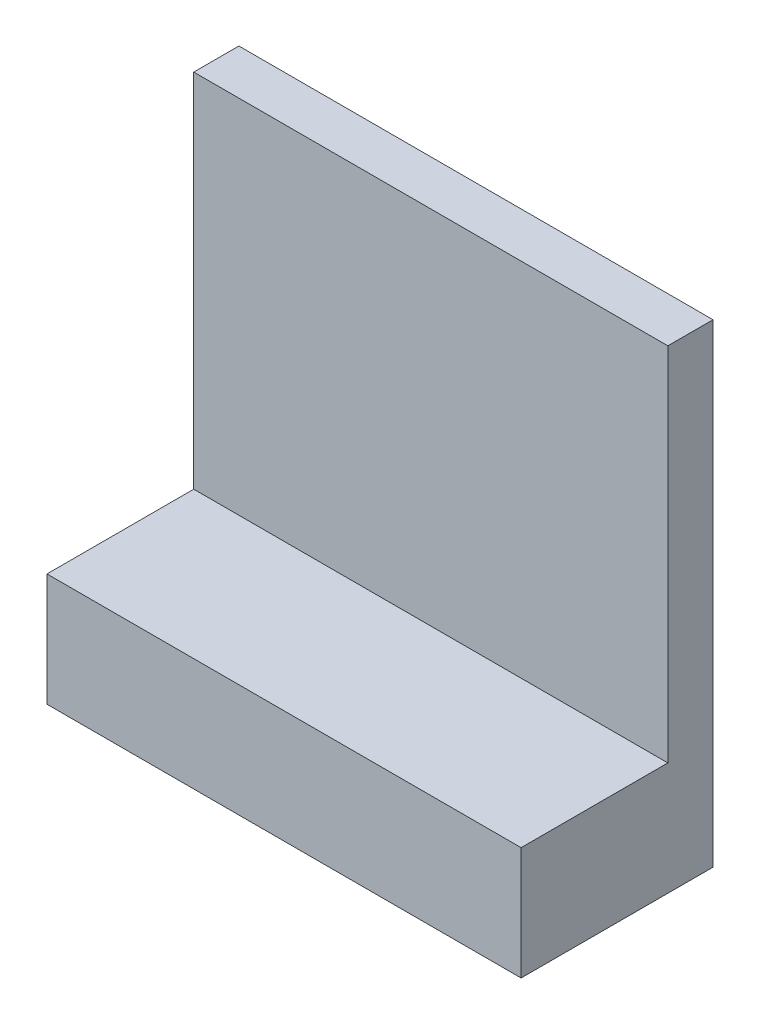
ISO-10303-21;
HEADER;
FILE_DESCRIPTION(('STEP AP214'),'2;1');
FILE_NAME('part.step','',(''),(''),'','','');
FILE_SCHEMA(('AUTOMOTIVE_DESIGN { 1 0 10303 214 1 1 1 1 }'));
ENDSEC;
DATA;
#1=APPLICATION_CONTEXT('core data for automotive mechanical design processes');
#2=APPLICATION_PROTOCOL_DEFINITION('international standard','automotive_design',2000,#1);
#3=PRODUCT_CONTEXT('',#1,'mechanical');
#4=PRODUCT('Part','Part','',(#3));
#5=PRODUCT_RELATED_PRODUCT_CATEGORY('part','',(#4));
#6=PRODUCT_DEFINITION_FORMATION('','',#4);
#7=PRODUCT_DEFINITION_CONTEXT('part definition',#1,'design');
#8=PRODUCT_DEFINITION('design','',#6,#7);
#9=PRODUCT_DEFINITION_SHAPE('','',#8);
#10=(LENGTH_UNIT() NAMED_UNIT(*) SI_UNIT(.MILLI.,.METRE.));
#11=(NAMED_UNIT(*) PLANE_ANGLE_UNIT() SI_UNIT($,.RADIAN.));
#12=(NAMED_UNIT(*) SI_UNIT($,.STERADIAN.) SOLID_ANGLE_UNIT());
#13=UNCERTAINTY_MEASURE_WITH_UNIT(LENGTH_MEASURE(1.E-05),#10,'distance_accuracy_value','');
#14=(GEOMETRIC_REPRESENTATION_CONTEXT(3) GLOBAL_UNCERTAINTY_ASSIGNED_CONTEXT((#13)) GLOBAL_UNIT_ASSIGNED_CONTEXT((#10,
#11,#12)) REPRESENTATION_CONTEXT('',''));
#15=CARTESIAN_POINT('',(0.,0.,0.));
#16=DIRECTION('',(0.,0.,1.));
#17=DIRECTION('',(1.,0.,0.));
#18=AXIS2_PLACEMENT_3D('',#15,#16,#17);
#19=CARTESIAN_POINT('',(-21.,21.,17.));
#20=DIRECTION('',(0.,-1.,0.));
#21=DIRECTION('',(0.,0.,-1.));
#22=AXIS2_PLACEMENT_3D('',#19,#20,#21);
#23=PLANE('',#22);
#24=DIRECTION('',(-1.,0.,0.));
#25=VECTOR('',#24,1.);
#26=CARTESIAN_POINT('',(-21.,21.,4.));
#27=LINE('',#26,#25);
#28=CARTESIAN_POINT('',(21.,21.,4.));
#29=VERTEX_POINT('',#28);
#30=CARTESIAN_POINT('',(-21.,21.,4.));
#31=VERTEX_POINT('',#30);
#32=EDGE_CURVE('E118',#29,#31,#27,.T.);
#33=ORIENTED_EDGE('',*,*,#32,.F.);
#34=DIRECTION('',(0.,0.,-1.));
#35=VECTOR('',#34,1.);
#36=CARTESIAN_POINT('',(21.,21.,17.));
#37=LINE('',#36,#35);
#38=CARTESIAN_POINT('',(21.,21.,0.));
#39=VERTEX_POINT('',#38);
#40=EDGE_CURVE('E11',#29,#39,#37,.T.);
#41=ORIENTED_EDGE('',*,*,#40,.T.);
#42=DIRECTION('',(-1.,0.,0.));
#43=VECTOR('',#42,1.);
#44=CARTESIAN_POINT('',(-21.,21.,0.));
#45=LINE('',#44,#43);
#46=CARTESIAN_POINT('',(-21.,21.,0.));
#47=VERTEX_POINT('',#46);
#48=EDGE_CURVE('E98',#39,#47,#45,.T.);
#49=ORIENTED_EDGE('',*,*,#48,.T.);
#50=DIRECTION('',(0.,0.,-1.));
#51=VECTOR('',#50,1.);
#52=CARTESIAN_POINT('',(-21.,21.,17.));
#53=LINE('',#52,#51);
#54=EDGE_CURVE('E41',#31,#47,#53,.T.);
#55=ORIENTED_EDGE('',*,*,#54,.F.);
#56=EDGE_LOOP('',(#33,#41,#49,#55));
#57=FACE_BOUND('',#56,.T.);
#58=ADVANCED_FACE('F33',(#57),#23,.F.);
#59=CARTESIAN_POINT('',(21.,-21.,17.));
#60=DIRECTION('',(-1.,0.,0.));
#61=DIRECTION('',(0.,0.,1.));
#62=AXIS2_PLACEMENT_3D('',#59,#60,#61);
#63=PLANE('',#62);
#64=DIRECTION('',(0.,1.,0.));
#65=VECTOR('',#64,1.);
#66=CARTESIAN_POINT('',(21.,21.,4.));
#67=LINE('',#66,#65);
#68=CARTESIAN_POINT('',(21.,-11.,4.));
#69=VERTEX_POINT('',#68);
#70=EDGE_CURVE('E121',#69,#29,#67,.T.);
#71=ORIENTED_EDGE('',*,*,#70,.F.);
#72=DIRECTION('',(0.,0.,1.));
#73=VECTOR('',#72,1.);
#74=CARTESIAN_POINT('',(21.,-11.,4.));
#75=LINE('',#74,#73);
#76=CARTESIAN_POINT('',(21.,-11.,17.));
#77=VERTEX_POINT('',#76);
#78=EDGE_CURVE('E99',#69,#77,#75,.T.);
#79=ORIENTED_EDGE('',*,*,#78,.T.);
#80=DIRECTION('',(0.,1.,0.));
#81=VECTOR('',#80,1.);
#82=CARTESIAN_POINT('',(21.,-21.,17.));
#83=LINE('',#82,#81);
#84=CARTESIAN_POINT('',(21.,-21.,17.));
#85=VERTEX_POINT('',#84);
#86=EDGE_CURVE('E85',#85,#77,#83,.T.);
#87=ORIENTED_EDGE('',*,*,#86,.F.);
#88=DIRECTION('',(0.,0.,-1.));
#89=VECTOR('',#88,1.);
#90=CARTESIAN_POINT('',(21.,-21.,17.));
#91=LINE('',#90,#89);
#92=CARTESIAN_POINT('',(21.,-21.,0.));
#93=VERTEX_POINT('',#92);
#94=EDGE_CURVE('E78',#85,#93,#91,.T.);
#95=ORIENTED_EDGE('',*,*,#94,.T.);
#96=DIRECTION('',(0.,1.,0.));
#97=VECTOR('',#96,1.);
#98=CARTESIAN_POINT('',(21.,-21.,0.));
#99=LINE('',#98,#97);
#100=EDGE_CURVE('E92',#93,#39,#99,.T.);
#101=ORIENTED_EDGE('',*,*,#100,.T.);
#102=ORIENTED_EDGE('',*,*,#40,.F.);
#103=EDGE_LOOP('',(#71,#79,#87,#95,#101,#102));
#104=FACE_BOUND('',#103,.T.);
#105=ADVANCED_FACE('F35',(#104),#63,.F.);
#106=CARTESIAN_POINT('',(-21.,-21.,17.));
#107=DIRECTION('',(1.,0.,0.));
#108=DIRECTION('',(0.,0.,-1.));
#109=AXIS2_PLACEMENT_3D('',#106,#107,#108);
#110=PLANE('',#109);
#111=DIRECTION('',(0.,-1.,0.));
#112=VECTOR('',#111,1.);
#113=CARTESIAN_POINT('',(-21.,-21.,17.));
#114=LINE('',#113,#112);
#115=CARTESIAN_POINT('',(-21.,-11.,17.));
#116=VERTEX_POINT('',#115);
#117=CARTESIAN_POINT('',(-21.,-21.,17.));
#118=VERTEX_POINT('',#117);
#119=EDGE_CURVE('E137',#116,#118,#114,.T.);
#120=ORIENTED_EDGE('',*,*,#119,.F.);
#121=DIRECTION('',(0.,0.,1.));
#122=VECTOR('',#121,1.);
#123=CARTESIAN_POINT('',(-21.,-11.,4.));
#124=LINE('',#123,#122);
#125=CARTESIAN_POINT('',(-21.,-11.,4.));
#126=VERTEX_POINT('',#125);
#127=EDGE_CURVE('E48',#126,#116,#124,.T.);
#128=ORIENTED_EDGE('',*,*,#127,.F.);
#129=DIRECTION('',(0.,-1.,0.));
#130=VECTOR('',#129,1.);
#131=CARTESIAN_POINT('',(-21.,21.,4.));
#132=LINE('',#131,#130);
#133=EDGE_CURVE('E113',#31,#126,#132,.T.);
#134=ORIENTED_EDGE('',*,*,#133,.F.);
#135=ORIENTED_EDGE('',*,*,#54,.T.);
#136=DIRECTION('',(0.,-1.,0.));
#137=VECTOR('',#136,1.);
#138=CARTESIAN_POINT('',(-21.,-21.,0.));
#139=LINE('',#138,#137);
#140=CARTESIAN_POINT('',(-21.,-21.,0.));
#141=VERTEX_POINT('',#140);
#142=EDGE_CURVE('E86',#47,#141,#139,.T.);
#143=ORIENTED_EDGE('',*,*,#142,.T.);
#144=DIRECTION('',(0.,0.,-1.));
#145=VECTOR('',#144,1.);
#146=CARTESIAN_POINT('',(-21.,-21.,17.));
#147=LINE('',#146,#145);
#148=EDGE_CURVE('E81',#118,#141,#147,.T.);
#149=ORIENTED_EDGE('',*,*,#148,.F.);
#150=EDGE_LOOP('',(#120,#128,#134,#135,#143,#149));
#151=FACE_BOUND('',#150,.T.);
#152=ADVANCED_FACE('F111',(#151),#110,.F.);
#153=CARTESIAN_POINT('',(-21.,-21.,17.));
#154=DIRECTION('',(0.,1.,0.));
#155=DIRECTION('',(0.,0.,1.));
#156=AXIS2_PLACEMENT_3D('',#153,#154,#155);
#157=PLANE('',#156);
#158=DIRECTION('',(1.,0.,0.));
#159=VECTOR('',#158,1.);
#160=CARTESIAN_POINT('',(-21.,-21.,0.));
#161=LINE('',#160,#159);
#162=EDGE_CURVE('E75',#141,#93,#161,.T.);
#163=ORIENTED_EDGE('',*,*,#162,.T.);
#164=ORIENTED_EDGE('',*,*,#94,.F.);
#165=DIRECTION('',(1.,0.,0.));
#166=VECTOR('',#165,1.);
#167=CARTESIAN_POINT('',(-21.,-21.,17.));
#168=LINE('',#167,#166);
#169=EDGE_CURVE('E57',#118,#85,#168,.T.);
#170=ORIENTED_EDGE('',*,*,#169,.F.);
#171=ORIENTED_EDGE('',*,*,#148,.T.);
#172=EDGE_LOOP('',(#163,#164,#170,#171));
#173=FACE_BOUND('',#172,.T.);
#174=ADVANCED_FACE('F77',(#173),#157,.F.);
#175=CARTESIAN_POINT('',(0.,0.,17.));
#176=DIRECTION('',(0.,0.,-1.));
#177=DIRECTION('',(-1.,0.,0.));
#178=AXIS2_PLACEMENT_3D('',#175,#176,#177);
#179=PLANE('',#178);
#180=ORIENTED_EDGE('',*,*,#86,.T.);
#181=DIRECTION('',(1.,0.,0.));
#182=VECTOR('',#181,1.);
#183=CARTESIAN_POINT('',(-21.,-11.,17.));
#184=LINE('',#183,#182);
#185=EDGE_CURVE('E131',#116,#77,#184,.T.);
#186=ORIENTED_EDGE('',*,*,#185,.F.);
#187=ORIENTED_EDGE('',*,*,#119,.T.);
#188=ORIENTED_EDGE('',*,*,#169,.T.);
#189=EDGE_LOOP('',(#180,#186,#187,#188));
#190=FACE_BOUND('',#189,.T.);
#191=ADVANCED_FACE('F142',(#190),#179,.F.);
#192=CARTESIAN_POINT('',(0.,0.,0.));
#193=DIRECTION('',(0.,0.,-1.));
#194=DIRECTION('',(-1.,0.,0.));
#195=AXIS2_PLACEMENT_3D('',#192,#193,#194);
#196=PLANE('',#195);
#197=ORIENTED_EDGE('',*,*,#100,.F.);
#198=ORIENTED_EDGE('',*,*,#162,.F.);
#199=ORIENTED_EDGE('',*,*,#142,.F.);
#200=ORIENTED_EDGE('',*,*,#48,.F.);
#201=EDGE_LOOP('',(#197,#198,#199,#200));
#202=FACE_BOUND('',#201,.T.);
#203=ADVANCED_FACE('F96',(#202),#196,.T.);
#204=CARTESIAN_POINT('',(-21.,-11.,4.));
#205=DIRECTION('',(0.,-1.,0.));
#206=DIRECTION('',(1.,0.,0.));
#207=AXIS2_PLACEMENT_3D('',#204,#205,#206);
#208=PLANE('',#207);
#209=ORIENTED_EDGE('',*,*,#185,.T.);
#210=ORIENTED_EDGE('',*,*,#78,.F.);
#211=DIRECTION('',(1.,0.,0.));
#212=VECTOR('',#211,1.);
#213=CARTESIAN_POINT('',(-21.,-11.,4.));
#214=LINE('',#213,#212);
#215=EDGE_CURVE('E132',#126,#69,#214,.T.);
#216=ORIENTED_EDGE('',*,*,#215,.F.);
#217=ORIENTED_EDGE('',*,*,#127,.T.);
#218=EDGE_LOOP('',(#209,#210,#216,#217));
#219=FACE_BOUND('',#218,.T.);
#220=ADVANCED_FACE('F133',(#219),#208,.F.);
#221=CARTESIAN_POINT('',(0.,0.,4.));
#222=DIRECTION('',(0.,0.,1.));
#223=DIRECTION('',(1.,0.,0.));
#224=AXIS2_PLACEMENT_3D('',#221,#222,#223);
#225=PLANE('',#224);
#226=ORIENTED_EDGE('',*,*,#133,.T.);
#227=ORIENTED_EDGE('',*,*,#215,.T.);
#228=ORIENTED_EDGE('',*,*,#70,.T.);
#229=ORIENTED_EDGE('',*,*,#32,.T.);
#230=EDGE_LOOP('',(#226,#227,#228,#229));
#231=FACE_BOUND('',#230,.T.);
#232=ADVANCED_FACE('F135',(#231),#225,.T.);
#233=CLOSED_SHELL('',(#58,#105,#152,#174,#191,#203,#220,#232));
#234=MANIFOLD_SOLID_BREP('B2',#233);
#235=ADVANCED_BREP_SHAPE_REPRESENTATION('',(#18,#234),#14);
#236=SHAPE_DEFINITION_REPRESENTATION(#9,#235);
ENDSEC;
END-ISO-10303-21;
